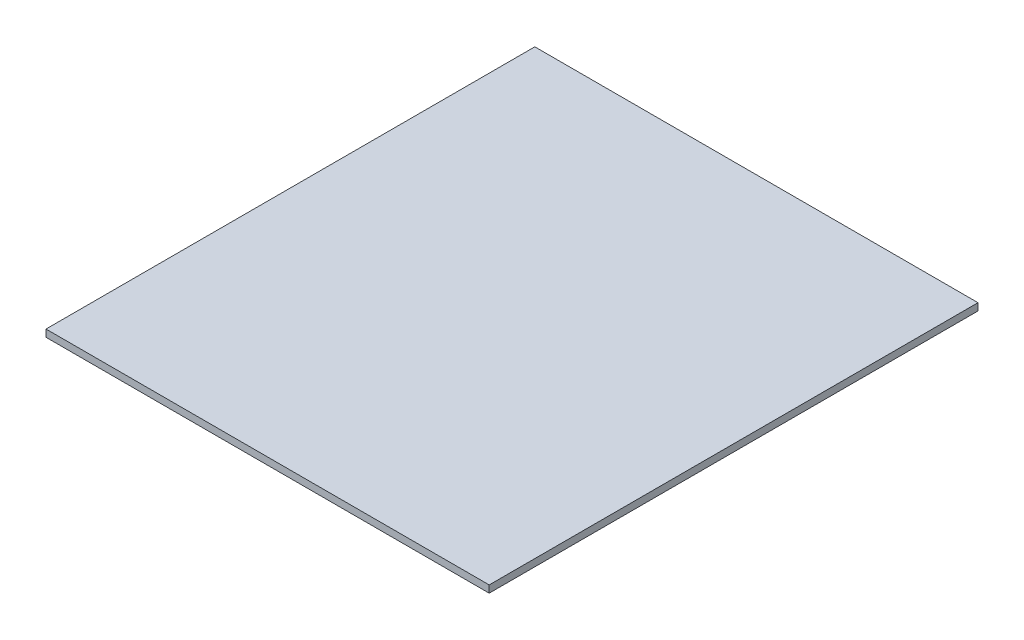
ISO-10303-21;
HEADER;
FILE_DESCRIPTION(('STEP AP214'),'2;1');
FILE_NAME('part.step','',(''),(''),'','','');
FILE_SCHEMA(('AUTOMOTIVE_DESIGN { 1 0 10303 214 1 1 1 1 }'));
ENDSEC;
DATA;
#1=APPLICATION_CONTEXT('core data for automotive mechanical design processes');
#2=APPLICATION_PROTOCOL_DEFINITION('international standard','automotive_design',2000,#1);
#3=PRODUCT_CONTEXT('',#1,'mechanical');
#4=PRODUCT('Part','Part','',(#3));
#5=PRODUCT_RELATED_PRODUCT_CATEGORY('part','',(#4));
#6=PRODUCT_DEFINITION_FORMATION('','',#4);
#7=PRODUCT_DEFINITION_CONTEXT('part definition',#1,'design');
#8=PRODUCT_DEFINITION('design','',#6,#7);
#9=PRODUCT_DEFINITION_SHAPE('','',#8);
#10=(LENGTH_UNIT() NAMED_UNIT(*) SI_UNIT(.MILLI.,.METRE.));
#11=(NAMED_UNIT(*) PLANE_ANGLE_UNIT() SI_UNIT($,.RADIAN.));
#12=(NAMED_UNIT(*) SI_UNIT($,.STERADIAN.) SOLID_ANGLE_UNIT());
#13=UNCERTAINTY_MEASURE_WITH_UNIT(LENGTH_MEASURE(1.E-05),#10,'distance_accuracy_value','');
#14=(GEOMETRIC_REPRESENTATION_CONTEXT(3) GLOBAL_UNCERTAINTY_ASSIGNED_CONTEXT((#13)) GLOBAL_UNIT_ASSIGNED_CONTEXT((#10,
#11,#12)) REPRESENTATION_CONTEXT('',''));
#15=CARTESIAN_POINT('',(0.,0.,0.));
#16=DIRECTION('',(0.,0.,1.));
#17=DIRECTION('',(1.,0.,0.));
#18=AXIS2_PLACEMENT_3D('',#15,#16,#17);
#19=CARTESIAN_POINT('',(340.,11.,375.));
#20=DIRECTION('',(-1.,0.,0.));
#21=DIRECTION('',(0.,0.,1.));
#22=AXIS2_PLACEMENT_3D('',#19,#20,#21);
#23=PLANE('',#22);
#24=DIRECTION('',(0.,0.,-1.));
#25=VECTOR('',#24,1.);
#26=CARTESIAN_POINT('',(340.,0.,375.));
#27=LINE('',#26,#25);
#28=CARTESIAN_POINT('',(340.,0.,375.));
#29=VERTEX_POINT('',#28);
#30=CARTESIAN_POINT('',(340.,0.,-375.));
#31=VERTEX_POINT('',#30);
#32=EDGE_CURVE('E100',#29,#31,#27,.T.);
#33=ORIENTED_EDGE('',*,*,#32,.T.);
#34=DIRECTION('',(0.,-1.,0.));
#35=VECTOR('',#34,1.);
#36=CARTESIAN_POINT('',(340.,11.,-375.));
#37=LINE('',#36,#35);
#38=CARTESIAN_POINT('',(340.,11.,-375.));
#39=VERTEX_POINT('',#38);
#40=EDGE_CURVE('E11',#39,#31,#37,.T.);
#41=ORIENTED_EDGE('',*,*,#40,.F.);
#42=DIRECTION('',(0.,0.,-1.));
#43=VECTOR('',#42,1.);
#44=CARTESIAN_POINT('',(340.,11.,375.));
#45=LINE('',#44,#43);
#46=CARTESIAN_POINT('',(340.,11.,375.));
#47=VERTEX_POINT('',#46);
#48=EDGE_CURVE('E88',#47,#39,#45,.T.);
#49=ORIENTED_EDGE('',*,*,#48,.F.);
#50=DIRECTION('',(0.,-1.,0.));
#51=VECTOR('',#50,1.);
#52=CARTESIAN_POINT('',(340.,11.,375.));
#53=LINE('',#52,#51);
#54=EDGE_CURVE('E96',#47,#29,#53,.T.);
#55=ORIENTED_EDGE('',*,*,#54,.T.);
#56=EDGE_LOOP('',(#33,#41,#49,#55));
#57=FACE_BOUND('',#56,.T.);
#58=ADVANCED_FACE('F37',(#57),#23,.F.);
#59=CARTESIAN_POINT('',(-340.,11.,-375.));
#60=DIRECTION('',(0.,0.,1.));
#61=DIRECTION('',(1.,0.,0.));
#62=AXIS2_PLACEMENT_3D('',#59,#60,#61);
#63=PLANE('',#62);
#64=DIRECTION('',(-1.,0.,0.));
#65=VECTOR('',#64,1.);
#66=CARTESIAN_POINT('',(-340.,0.,-375.));
#67=LINE('',#66,#65);
#68=CARTESIAN_POINT('',(-340.,0.,-375.));
#69=VERTEX_POINT('',#68);
#70=EDGE_CURVE('E92',#31,#69,#67,.T.);
#71=ORIENTED_EDGE('',*,*,#70,.T.);
#72=DIRECTION('',(0.,-1.,0.));
#73=VECTOR('',#72,1.);
#74=CARTESIAN_POINT('',(-340.,11.,-375.));
#75=LINE('',#74,#73);
#76=CARTESIAN_POINT('',(-340.,11.,-375.));
#77=VERTEX_POINT('',#76);
#78=EDGE_CURVE('E45',#77,#69,#75,.T.);
#79=ORIENTED_EDGE('',*,*,#78,.F.);
#80=DIRECTION('',(-1.,0.,0.));
#81=VECTOR('',#80,1.);
#82=CARTESIAN_POINT('',(-340.,11.,-375.));
#83=LINE('',#82,#81);
#84=EDGE_CURVE('E83',#39,#77,#83,.T.);
#85=ORIENTED_EDGE('',*,*,#84,.F.);
#86=ORIENTED_EDGE('',*,*,#40,.T.);
#87=EDGE_LOOP('',(#71,#79,#85,#86));
#88=FACE_BOUND('',#87,.T.);
#89=ADVANCED_FACE('F91',(#88),#63,.F.);
#90=CARTESIAN_POINT('',(-340.,11.,375.));
#91=DIRECTION('',(1.,0.,0.));
#92=DIRECTION('',(0.,0.,-1.));
#93=AXIS2_PLACEMENT_3D('',#90,#91,#92);
#94=PLANE('',#93);
#95=DIRECTION('',(0.,0.,1.));
#96=VECTOR('',#95,1.);
#97=CARTESIAN_POINT('',(-340.,0.,375.));
#98=LINE('',#97,#96);
#99=CARTESIAN_POINT('',(-340.,0.,375.));
#100=VERTEX_POINT('',#99);
#101=EDGE_CURVE('E70',#69,#100,#98,.T.);
#102=ORIENTED_EDGE('',*,*,#101,.T.);
#103=DIRECTION('',(0.,-1.,0.));
#104=VECTOR('',#103,1.);
#105=CARTESIAN_POINT('',(-340.,11.,375.));
#106=LINE('',#105,#104);
#107=CARTESIAN_POINT('',(-340.,11.,375.));
#108=VERTEX_POINT('',#107);
#109=EDGE_CURVE('E93',#108,#100,#106,.T.);
#110=ORIENTED_EDGE('',*,*,#109,.F.);
#111=DIRECTION('',(0.,0.,1.));
#112=VECTOR('',#111,1.);
#113=CARTESIAN_POINT('',(-340.,11.,375.));
#114=LINE('',#113,#112);
#115=EDGE_CURVE('E86',#77,#108,#114,.T.);
#116=ORIENTED_EDGE('',*,*,#115,.F.);
#117=ORIENTED_EDGE('',*,*,#78,.T.);
#118=EDGE_LOOP('',(#102,#110,#116,#117));
#119=FACE_BOUND('',#118,.T.);
#120=ADVANCED_FACE('F94',(#119),#94,.F.);
#121=CARTESIAN_POINT('',(-340.,11.,375.));
#122=DIRECTION('',(0.,0.,-1.));
#123=DIRECTION('',(-1.,0.,0.));
#124=AXIS2_PLACEMENT_3D('',#121,#122,#123);
#125=PLANE('',#124);
#126=DIRECTION('',(1.,0.,0.));
#127=VECTOR('',#126,1.);
#128=CARTESIAN_POINT('',(-340.,0.,375.));
#129=LINE('',#128,#127);
#130=EDGE_CURVE('E76',#100,#29,#129,.T.);
#131=ORIENTED_EDGE('',*,*,#130,.T.);
#132=ORIENTED_EDGE('',*,*,#54,.F.);
#133=DIRECTION('',(1.,0.,0.));
#134=VECTOR('',#133,1.);
#135=CARTESIAN_POINT('',(-340.,11.,375.));
#136=LINE('',#135,#134);
#137=EDGE_CURVE('E53',#108,#47,#136,.T.);
#138=ORIENTED_EDGE('',*,*,#137,.F.);
#139=ORIENTED_EDGE('',*,*,#109,.T.);
#140=EDGE_LOOP('',(#131,#132,#138,#139));
#141=FACE_BOUND('',#140,.T.);
#142=ADVANCED_FACE('F107',(#141),#125,.F.);
#143=CARTESIAN_POINT('',(0.,11.,0.));
#144=DIRECTION('',(0.,-1.,0.));
#145=DIRECTION('',(0.,0.,-1.));
#146=AXIS2_PLACEMENT_3D('',#143,#144,#145);
#147=PLANE('',#146);
#148=ORIENTED_EDGE('',*,*,#48,.T.);
#149=ORIENTED_EDGE('',*,*,#84,.T.);
#150=ORIENTED_EDGE('',*,*,#115,.T.);
#151=ORIENTED_EDGE('',*,*,#137,.T.);
#152=EDGE_LOOP('',(#148,#149,#150,#151));
#153=FACE_BOUND('',#152,.T.);
#154=ADVANCED_FACE('F84',(#153),#147,.F.);
#155=CARTESIAN_POINT('',(0.,0.,0.));
#156=DIRECTION('',(0.,-1.,0.));
#157=DIRECTION('',(0.,0.,-1.));
#158=AXIS2_PLACEMENT_3D('',#155,#156,#157);
#159=PLANE('',#158);
#160=ORIENTED_EDGE('',*,*,#32,.F.);
#161=ORIENTED_EDGE('',*,*,#130,.F.);
#162=ORIENTED_EDGE('',*,*,#101,.F.);
#163=ORIENTED_EDGE('',*,*,#70,.F.);
#164=EDGE_LOOP('',(#160,#161,#162,#163));
#165=FACE_BOUND('',#164,.T.);
#166=ADVANCED_FACE('F110',(#165),#159,.T.);
#167=CLOSED_SHELL('',(#58,#89,#120,#142,#154,#166));
#168=MANIFOLD_SOLID_BREP('B2',#167);
#169=ADVANCED_BREP_SHAPE_REPRESENTATION('',(#18,#168),#14);
#170=SHAPE_DEFINITION_REPRESENTATION(#9,#169);
ENDSEC;
END-ISO-10303-21;
